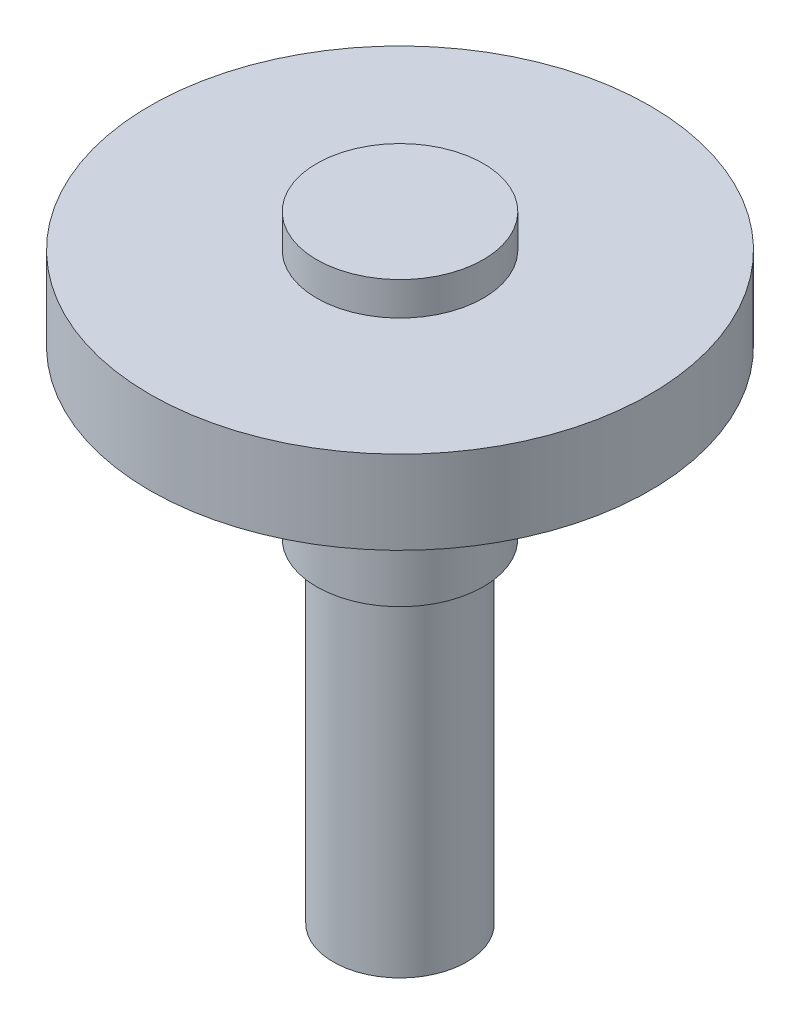
ISO-10303-21;
HEADER;
FILE_DESCRIPTION(('STEP AP214'),'2;1');
FILE_NAME('part.step','',(''),(''),'','','');
FILE_SCHEMA(('AUTOMOTIVE_DESIGN { 1 0 10303 214 1 1 1 1 }'));
ENDSEC;
DATA;
#1=APPLICATION_CONTEXT('core data for automotive mechanical design processes');
#2=APPLICATION_PROTOCOL_DEFINITION('international standard','automotive_design',2000,#1);
#3=PRODUCT_CONTEXT('',#1,'mechanical');
#4=PRODUCT('Part','Part','',(#3));
#5=PRODUCT_RELATED_PRODUCT_CATEGORY('part','',(#4));
#6=PRODUCT_DEFINITION_FORMATION('','',#4);
#7=PRODUCT_DEFINITION_CONTEXT('part definition',#1,'design');
#8=PRODUCT_DEFINITION('design','',#6,#7);
#9=PRODUCT_DEFINITION_SHAPE('','',#8);
#10=(LENGTH_UNIT() NAMED_UNIT(*) SI_UNIT(.MILLI.,.METRE.));
#11=(NAMED_UNIT(*) PLANE_ANGLE_UNIT() SI_UNIT($,.RADIAN.));
#12=(NAMED_UNIT(*) SI_UNIT($,.STERADIAN.) SOLID_ANGLE_UNIT());
#13=UNCERTAINTY_MEASURE_WITH_UNIT(LENGTH_MEASURE(1.E-05),#10,'distance_accuracy_value','');
#14=(GEOMETRIC_REPRESENTATION_CONTEXT(3) GLOBAL_UNCERTAINTY_ASSIGNED_CONTEXT((#13)) GLOBAL_UNIT_ASSIGNED_CONTEXT((#10,
#11,#12)) REPRESENTATION_CONTEXT('',''));
#15=CARTESIAN_POINT('',(0.,0.,0.));
#16=DIRECTION('',(0.,0.,1.));
#17=DIRECTION('',(1.,0.,0.));
#18=AXIS2_PLACEMENT_3D('',#15,#16,#17);
#19=CARTESIAN_POINT('',(0.,-10.,0.));
#20=DIRECTION('',(0.,-1.,0.));
#21=DIRECTION('',(0.,0.,-1.));
#22=AXIS2_PLACEMENT_3D('',#19,#20,#21);
#23=PLANE('',#22);
#24=CARTESIAN_POINT('',(0.,-10.,0.));
#25=DIRECTION('',(0.,-1.,0.));
#26=DIRECTION('',(0.,0.,-1.));
#27=AXIS2_PLACEMENT_3D('',#24,#25,#26);
#28=CIRCLE('',#27,5.);
#29=CARTESIAN_POINT('',(0.,-10.,-5.));
#30=VERTEX_POINT('',#29);
#31=EDGE_CURVE('E52',#30,#30,#28,.T.);
#32=ORIENTED_EDGE('',*,*,#31,.T.);
#33=EDGE_LOOP('',(#32));
#34=FACE_BOUND('',#33,.T.);
#35=CARTESIAN_POINT('',(0.,-10.,0.));
#36=DIRECTION('',(0.,-1.,0.));
#37=DIRECTION('',(0.,0.,-1.));
#38=AXIS2_PLACEMENT_3D('',#35,#36,#37);
#39=CIRCLE('',#38,4.);
#40=CARTESIAN_POINT('',(0.,-10.,-4.));
#41=VERTEX_POINT('',#40);
#42=EDGE_CURVE('E58',#41,#41,#39,.T.);
#43=ORIENTED_EDGE('',*,*,#42,.F.);
#44=EDGE_LOOP('',(#43));
#45=FACE_BOUND('',#44,.T.);
#46=ADVANCED_FACE('F31',(#34,#45),#23,.T.);
#47=CARTESIAN_POINT('',(0.,0.,0.));
#48=DIRECTION('',(0.,1.,0.));
#49=DIRECTION('',(0.,0.,1.));
#50=AXIS2_PLACEMENT_3D('',#47,#48,#49);
#51=PLANE('',#50);
#52=CARTESIAN_POINT('',(0.,0.,0.));
#53=DIRECTION('',(0.,1.,0.));
#54=DIRECTION('',(0.,0.,1.));
#55=AXIS2_PLACEMENT_3D('',#52,#53,#54);
#56=CIRCLE('',#55,15.);
#57=CARTESIAN_POINT('',(0.,0.,15.));
#58=VERTEX_POINT('',#57);
#59=EDGE_CURVE('E42',#58,#58,#56,.T.);
#60=ORIENTED_EDGE('',*,*,#59,.F.);
#61=EDGE_LOOP('',(#60));
#62=FACE_BOUND('',#61,.T.);
#63=CARTESIAN_POINT('',(0.,0.,0.));
#64=DIRECTION('',(0.,1.,0.));
#65=DIRECTION('',(0.,0.,1.));
#66=AXIS2_PLACEMENT_3D('',#63,#64,#65);
#67=CIRCLE('',#66,5.);
#68=CARTESIAN_POINT('',(0.,0.,5.));
#69=VERTEX_POINT('',#68);
#70=EDGE_CURVE('E10',#69,#69,#67,.F.);
#71=ORIENTED_EDGE('',*,*,#70,.F.);
#72=EDGE_LOOP('',(#71));
#73=FACE_BOUND('',#72,.T.);
#74=ADVANCED_FACE('F74',(#62,#73),#51,.F.);
#75=CARTESIAN_POINT('',(0.,5.,0.));
#76=DIRECTION('',(0.,1.,0.));
#77=DIRECTION('',(0.,0.,1.));
#78=AXIS2_PLACEMENT_3D('',#75,#76,#77);
#79=PLANE('',#78);
#80=CARTESIAN_POINT('',(0.,5.,0.));
#81=DIRECTION('',(0.,1.,0.));
#82=DIRECTION('',(0.,0.,1.));
#83=AXIS2_PLACEMENT_3D('',#80,#81,#82);
#84=CIRCLE('',#83,15.);
#85=CARTESIAN_POINT('',(0.,5.,15.));
#86=VERTEX_POINT('',#85);
#87=EDGE_CURVE('E38',#86,#86,#84,.T.);
#88=ORIENTED_EDGE('',*,*,#87,.T.);
#89=EDGE_LOOP('',(#88));
#90=FACE_BOUND('',#89,.T.);
#91=CARTESIAN_POINT('',(0.,5.,0.));
#92=DIRECTION('',(0.,1.,0.));
#93=DIRECTION('',(0.,0.,1.));
#94=AXIS2_PLACEMENT_3D('',#91,#92,#93);
#95=CIRCLE('',#94,5.);
#96=CARTESIAN_POINT('',(0.,5.,5.));
#97=VERTEX_POINT('',#96);
#98=EDGE_CURVE('E49',#97,#97,#95,.T.);
#99=ORIENTED_EDGE('',*,*,#98,.F.);
#100=EDGE_LOOP('',(#99));
#101=FACE_BOUND('',#100,.T.);
#102=ADVANCED_FACE('F80',(#90,#101),#79,.T.);
#103=CARTESIAN_POINT('',(0.,5.,0.));
#104=DIRECTION('',(0.,-1.,0.));
#105=DIRECTION('',(0.,0.,-1.));
#106=AXIS2_PLACEMENT_3D('',#103,#104,#105);
#107=CYLINDRICAL_SURFACE('',#106,15.);
#108=ORIENTED_EDGE('',*,*,#87,.F.);
#109=EDGE_LOOP('',(#108));
#110=FACE_BOUND('',#109,.T.);
#111=ORIENTED_EDGE('',*,*,#59,.T.);
#112=EDGE_LOOP('',(#111));
#113=FACE_BOUND('',#112,.T.);
#114=ADVANCED_FACE('F33',(#110,#113),#107,.T.);
#115=CARTESIAN_POINT('',(0.,7.,0.));
#116=DIRECTION('',(0.,-1.,0.));
#117=DIRECTION('',(0.,0.,-1.));
#118=AXIS2_PLACEMENT_3D('',#115,#116,#117);
#119=CYLINDRICAL_SURFACE('',#118,5.);
#120=CARTESIAN_POINT('',(0.,7.,0.));
#121=DIRECTION('',(0.,1.,0.));
#122=DIRECTION('',(0.,0.,1.));
#123=AXIS2_PLACEMENT_3D('',#120,#121,#122);
#124=CIRCLE('',#123,5.);
#125=CARTESIAN_POINT('',(0.,7.,5.));
#126=VERTEX_POINT('',#125);
#127=EDGE_CURVE('E47',#126,#126,#124,.T.);
#128=ORIENTED_EDGE('',*,*,#127,.F.);
#129=EDGE_LOOP('',(#128));
#130=FACE_BOUND('',#129,.T.);
#131=ORIENTED_EDGE('',*,*,#98,.T.);
#132=EDGE_LOOP('',(#131));
#133=FACE_BOUND('',#132,.T.);
#134=ADVANCED_FACE('F90',(#130,#133),#119,.T.);
#135=CARTESIAN_POINT('',(0.,7.,0.));
#136=DIRECTION('',(0.,1.,0.));
#137=DIRECTION('',(0.,0.,1.));
#138=AXIS2_PLACEMENT_3D('',#135,#136,#137);
#139=PLANE('',#138);
#140=ORIENTED_EDGE('',*,*,#127,.T.);
#141=EDGE_LOOP('',(#140));
#142=FACE_BOUND('',#141,.T.);
#143=ADVANCED_FACE('F86',(#142),#139,.T.);
#144=CARTESIAN_POINT('',(0.,-10.,0.));
#145=DIRECTION('',(0.,1.,0.));
#146=DIRECTION('',(0.,0.,1.));
#147=AXIS2_PLACEMENT_3D('',#144,#145,#146);
#148=CYLINDRICAL_SURFACE('',#147,5.);
#149=ORIENTED_EDGE('',*,*,#31,.F.);
#150=EDGE_LOOP('',(#149));
#151=FACE_BOUND('',#150,.T.);
#152=ORIENTED_EDGE('',*,*,#70,.T.);
#153=EDGE_LOOP('',(#152));
#154=FACE_BOUND('',#153,.T.);
#155=ADVANCED_FACE('F69',(#151,#154),#148,.T.);
#156=CARTESIAN_POINT('',(0.,-30.,0.));
#157=DIRECTION('',(0.,1.,0.));
#158=DIRECTION('',(0.,0.,1.));
#159=AXIS2_PLACEMENT_3D('',#156,#157,#158);
#160=CYLINDRICAL_SURFACE('',#159,4.);
#161=CARTESIAN_POINT('',(0.,-30.,0.));
#162=DIRECTION('',(0.,-1.,0.));
#163=DIRECTION('',(0.,0.,-1.));
#164=AXIS2_PLACEMENT_3D('',#161,#162,#163);
#165=CIRCLE('',#164,4.);
#166=CARTESIAN_POINT('',(0.,-30.,-4.));
#167=VERTEX_POINT('',#166);
#168=EDGE_CURVE('E57',#167,#167,#165,.T.);
#169=ORIENTED_EDGE('',*,*,#168,.F.);
#170=EDGE_LOOP('',(#169));
#171=FACE_BOUND('',#170,.T.);
#172=ORIENTED_EDGE('',*,*,#42,.T.);
#173=EDGE_LOOP('',(#172));
#174=FACE_BOUND('',#173,.T.);
#175=ADVANCED_FACE('F66',(#171,#174),#160,.T.);
#176=CARTESIAN_POINT('',(0.,-30.,0.));
#177=DIRECTION('',(0.,-1.,0.));
#178=DIRECTION('',(0.,0.,-1.));
#179=AXIS2_PLACEMENT_3D('',#176,#177,#178);
#180=PLANE('',#179);
#181=ORIENTED_EDGE('',*,*,#168,.T.);
#182=EDGE_LOOP('',(#181));
#183=FACE_BOUND('',#182,.T.);
#184=ADVANCED_FACE('F64',(#183),#180,.T.);
#185=CLOSED_SHELL('',(#46,#74,#102,#114,#134,#143,#155,#175,#184));
#186=MANIFOLD_SOLID_BREP('B2',#185);
#187=ADVANCED_BREP_SHAPE_REPRESENTATION('',(#18,#186),#14);
#188=SHAPE_DEFINITION_REPRESENTATION(#9,#187);
ENDSEC;
END-ISO-10303-21;
